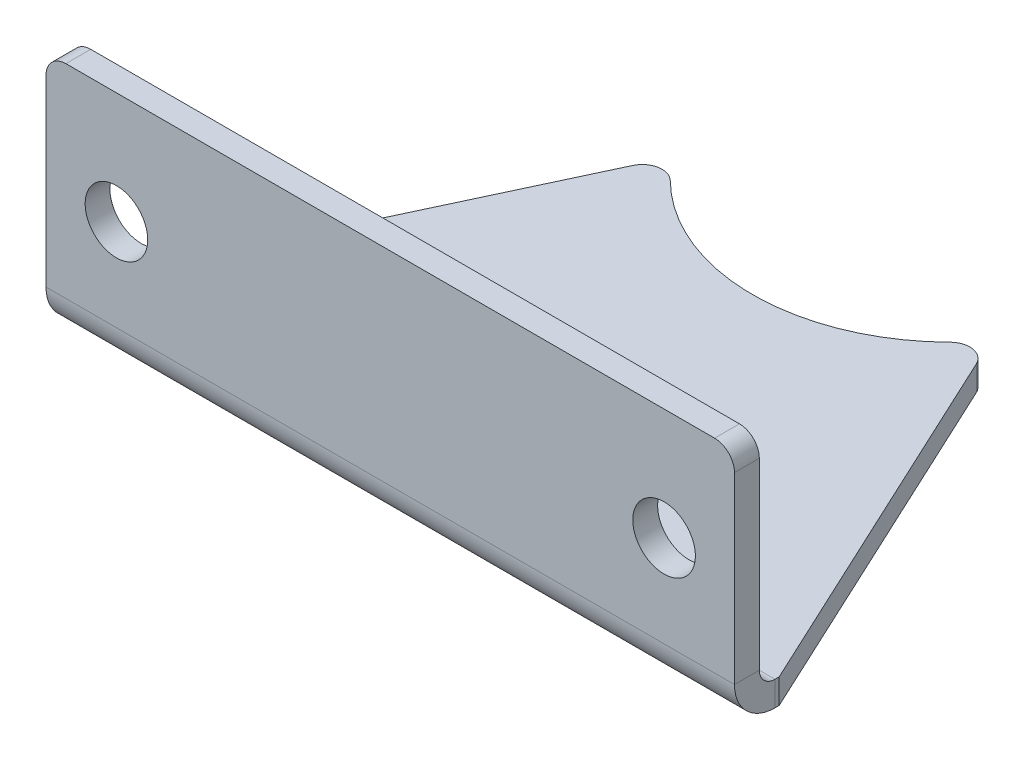
ISO-10303-21;
HEADER;
FILE_DESCRIPTION(('STEP AP214'),'2;1');
FILE_NAME('part.step','',(''),(''),'','','');
FILE_SCHEMA(('AUTOMOTIVE_DESIGN { 1 0 10303 214 1 1 1 1 }'));
ENDSEC;
DATA;
#1=APPLICATION_CONTEXT('core data for automotive mechanical design processes');
#2=APPLICATION_PROTOCOL_DEFINITION('international standard','automotive_design',2000,#1);
#3=PRODUCT_CONTEXT('',#1,'mechanical');
#4=PRODUCT('Part','Part','',(#3));
#5=PRODUCT_RELATED_PRODUCT_CATEGORY('part','',(#4));
#6=PRODUCT_DEFINITION_FORMATION('','',#4);
#7=PRODUCT_DEFINITION_CONTEXT('part definition',#1,'design');
#8=PRODUCT_DEFINITION('design','',#6,#7);
#9=PRODUCT_DEFINITION_SHAPE('','',#8);
#10=(LENGTH_UNIT() NAMED_UNIT(*) SI_UNIT(.MILLI.,.METRE.));
#11=(NAMED_UNIT(*) PLANE_ANGLE_UNIT() SI_UNIT($,.RADIAN.));
#12=(NAMED_UNIT(*) SI_UNIT($,.STERADIAN.) SOLID_ANGLE_UNIT());
#13=UNCERTAINTY_MEASURE_WITH_UNIT(LENGTH_MEASURE(1.E-05),#10,'distance_accuracy_value','');
#14=(GEOMETRIC_REPRESENTATION_CONTEXT(3) GLOBAL_UNCERTAINTY_ASSIGNED_CONTEXT((#13)) GLOBAL_UNIT_ASSIGNED_CONTEXT((#10,
#11,#12)) REPRESENTATION_CONTEXT('',''));
#15=CARTESIAN_POINT('',(0.,0.,0.));
#16=DIRECTION('',(0.,0.,1.));
#17=DIRECTION('',(1.,0.,0.));
#18=AXIS2_PLACEMENT_3D('',#15,#16,#17);
#19=CARTESIAN_POINT('',(-21.999999942,-1.5875,33.));
#20=DIRECTION('',(-0.906237866206464,0.,-0.422768175071818));
#21=DIRECTION('',(-0.422768175071818,0.,0.906237866206464));
#22=AXIS2_PLACEMENT_3D('',#19,#20,#21);
#23=PLANE('',#22);
#24=DIRECTION('',(-0.422768175071818,0.,0.906237866206464));
#25=VECTOR('',#24,1.);
#26=CARTESIAN_POINT('',(-21.999999942,0.,33.));
#27=LINE('',#26,#25);
#28=CARTESIAN_POINT('',(-10.9840169846898,0.,9.38634722752335));
#29=VERTEX_POINT('',#28);
#30=CARTESIAN_POINT('',(-21.999999942,0.,33.));
#31=VERTEX_POINT('',#30);
#32=EDGE_CURVE('E240',#29,#31,#27,.T.);
#33=ORIENTED_EDGE('',*,*,#32,.F.);
#34=DIRECTION('',(0.,1.,0.));
#35=VECTOR('',#34,1.);
#36=CARTESIAN_POINT('',(-10.9840169846898,-1.5875,9.38634722752335));
#37=LINE('',#36,#35);
#38=CARTESIAN_POINT('',(-10.9840169846898,-1.5875,9.38634722752335));
#39=VERTEX_POINT('',#38);
#40=EDGE_CURVE('E13',#29,#39,#37,.F.);
#41=ORIENTED_EDGE('',*,*,#40,.T.);
#42=DIRECTION('',(-0.422768175071818,0.,0.906237866206464));
#43=VECTOR('',#42,1.);
#44=CARTESIAN_POINT('',(-21.999999942,-1.5875,33.));
#45=LINE('',#44,#43);
#46=CARTESIAN_POINT('',(-21.999999942,-1.5875,33.));
#47=VERTEX_POINT('',#46);
#48=EDGE_CURVE('E243',#39,#47,#45,.T.);
#49=ORIENTED_EDGE('',*,*,#48,.T.);
#50=DIRECTION('',(0.,1.,0.));
#51=VECTOR('',#50,1.);
#52=CARTESIAN_POINT('',(-21.999999942,-1.5875,33.));
#53=LINE('',#52,#51);
#54=EDGE_CURVE('E251',#47,#31,#53,.T.);
#55=ORIENTED_EDGE('',*,*,#54,.T.);
#56=EDGE_LOOP('',(#33,#41,#49,#55));
#57=FACE_BOUND('',#56,.T.);
#58=ADVANCED_FACE('F62',(#57),#23,.T.);
#59=CARTESIAN_POINT('',(0.,-1.5875,0.));
#60=DIRECTION('',(0.,1.,0.));
#61=DIRECTION('',(0.,0.,1.));
#62=AXIS2_PLACEMENT_3D('',#59,#60,#61);
#63=CYLINDRICAL_SURFACE('',#62,12.7);
#64=CARTESIAN_POINT('',(0.,0.,0.));
#65=DIRECTION('',(0.,-1.,0.));
#66=DIRECTION('',(0.,0.,1.));
#67=AXIS2_PLACEMENT_3D('',#64,#65,#66);
#68=CIRCLE('',#67,12.7);
#69=CARTESIAN_POINT('',(8.93917717691604,0.,9.02114800896778));
#70=VERTEX_POINT('',#69);
#71=CARTESIAN_POINT('',(-8.93917717691603,0.,9.02114800896778));
#72=VERTEX_POINT('',#71);
#73=EDGE_CURVE('E246',#70,#72,#68,.T.);
#74=ORIENTED_EDGE('',*,*,#73,.F.);
#75=DIRECTION('',(0.,1.,0.));
#76=VECTOR('',#75,1.);
#77=CARTESIAN_POINT('',(8.93917717691604,-1.5875,9.02114800896778));
#78=LINE('',#77,#76);
#79=CARTESIAN_POINT('',(8.93917717691604,-1.5875,9.02114800896778));
#80=VERTEX_POINT('',#79);
#81=EDGE_CURVE('E290',#70,#80,#78,.F.);
#82=ORIENTED_EDGE('',*,*,#81,.T.);
#83=CARTESIAN_POINT('',(0.,-1.5875,0.));
#84=DIRECTION('',(0.,-1.,0.));
#85=DIRECTION('',(0.,0.,1.));
#86=AXIS2_PLACEMENT_3D('',#83,#84,#85);
#87=CIRCLE('',#86,12.7);
#88=CARTESIAN_POINT('',(-8.93917717691603,-1.5875,9.02114800896778));
#89=VERTEX_POINT('',#88);
#90=EDGE_CURVE('E249',#80,#89,#87,.T.);
#91=ORIENTED_EDGE('',*,*,#90,.T.);
#92=DIRECTION('',(0.,1.,0.));
#93=VECTOR('',#92,1.);
#94=CARTESIAN_POINT('',(-8.93917717691603,-1.5875,9.02114800896778));
#95=LINE('',#94,#93);
#96=EDGE_CURVE('E287',#89,#72,#95,.T.);
#97=ORIENTED_EDGE('',*,*,#96,.T.);
#98=EDGE_LOOP('',(#74,#82,#91,#97));
#99=FACE_BOUND('',#98,.T.);
#100=ADVANCED_FACE('F305',(#99),#63,.F.);
#101=CARTESIAN_POINT('',(21.999999942,-1.5875,33.));
#102=DIRECTION('',(0.906237866206464,0.,-0.422768175071818));
#103=DIRECTION('',(-0.422768175071818,0.,-0.906237866206464));
#104=AXIS2_PLACEMENT_3D('',#101,#102,#103);
#105=PLANE('',#104);
#106=DIRECTION('',(-0.422768175071818,0.,-0.906237866206464));
#107=VECTOR('',#106,1.);
#108=CARTESIAN_POINT('',(21.999999942,-1.5875,33.));
#109=LINE('',#108,#107);
#110=CARTESIAN_POINT('',(21.999999942,-1.5875,33.));
#111=VERTEX_POINT('',#110);
#112=CARTESIAN_POINT('',(10.9840169846899,-1.5875,9.38634722752336));
#113=VERTEX_POINT('',#112);
#114=EDGE_CURVE('E245',#111,#113,#109,.T.);
#115=ORIENTED_EDGE('',*,*,#114,.T.);
#116=DIRECTION('',(0.,1.,0.));
#117=VECTOR('',#116,1.);
#118=CARTESIAN_POINT('',(10.9840169846899,-1.5875,9.38634722752335));
#119=LINE('',#118,#117);
#120=CARTESIAN_POINT('',(10.9840169846899,0.,9.38634722752336));
#121=VERTEX_POINT('',#120);
#122=EDGE_CURVE('E280',#113,#121,#119,.T.);
#123=ORIENTED_EDGE('',*,*,#122,.T.);
#124=DIRECTION('',(-0.422768175071818,0.,-0.906237866206464));
#125=VECTOR('',#124,1.);
#126=CARTESIAN_POINT('',(21.999999942,0.,33.));
#127=LINE('',#126,#125);
#128=CARTESIAN_POINT('',(21.999999942,0.,33.));
#129=VERTEX_POINT('',#128);
#130=EDGE_CURVE('E253',#129,#121,#127,.T.);
#131=ORIENTED_EDGE('',*,*,#130,.F.);
#132=DIRECTION('',(0.,1.,0.));
#133=VECTOR('',#132,1.);
#134=CARTESIAN_POINT('',(21.999999942,-1.5875,33.));
#135=LINE('',#134,#133);
#136=EDGE_CURVE('E258',#111,#129,#135,.T.);
#137=ORIENTED_EDGE('',*,*,#136,.F.);
#138=EDGE_LOOP('',(#115,#123,#131,#137));
#139=FACE_BOUND('',#138,.T.);
#140=ADVANCED_FACE('F299',(#139),#105,.T.);
#141=CARTESIAN_POINT('',(0.,-1.5875,0.));
#142=DIRECTION('',(0.,1.,0.));
#143=DIRECTION('',(0.,0.,1.));
#144=AXIS2_PLACEMENT_3D('',#141,#142,#143);
#145=PLANE('',#144);
#146=ORIENTED_EDGE('',*,*,#90,.F.);
#147=CARTESIAN_POINT('',(9.83309489460765,-1.5875,9.92326280986456));
#148=DIRECTION('',(0.,1.,0.));
#149=DIRECTION('',(0.,0.,1.));
#150=AXIS2_PLACEMENT_3D('',#147,#148,#149);
#151=CIRCLE('',#150,1.27);
#152=EDGE_CURVE('E70',#80,#113,#151,.F.);
#153=ORIENTED_EDGE('',*,*,#152,.T.);
#154=ORIENTED_EDGE('',*,*,#114,.F.);
#155=DIRECTION('',(0.,0.,-1.));
#156=VECTOR('',#155,1.);
#157=CARTESIAN_POINT('',(21.999999942,-1.58750000000001,33.27));
#158=LINE('',#157,#156);
#159=CARTESIAN_POINT('',(21.999999942,-1.58750000000001,33.27));
#160=VERTEX_POINT('',#159);
#161=EDGE_CURVE('E234',#160,#111,#158,.T.);
#162=ORIENTED_EDGE('',*,*,#161,.F.);
#163=DIRECTION('',(1.,0.,0.));
#164=VECTOR('',#163,1.);
#165=CARTESIAN_POINT('',(21.999999942,-1.58750000000001,33.27));
#166=LINE('',#165,#164);
#167=CARTESIAN_POINT('',(-21.999999942,-1.58750000000001,33.27));
#168=VERTEX_POINT('',#167);
#169=EDGE_CURVE('E170',#160,#168,#166,.F.);
#170=ORIENTED_EDGE('',*,*,#169,.T.);
#171=DIRECTION('',(0.,0.,-1.));
#172=VECTOR('',#171,1.);
#173=CARTESIAN_POINT('',(-21.999999942,-1.58750000000001,33.27));
#174=LINE('',#173,#172);
#175=EDGE_CURVE('E231',#168,#47,#174,.T.);
#176=ORIENTED_EDGE('',*,*,#175,.T.);
#177=ORIENTED_EDGE('',*,*,#48,.F.);
#178=CARTESIAN_POINT('',(-9.83309489460764,-1.5875,9.92326280986456));
#179=DIRECTION('',(0.,1.,0.));
#180=DIRECTION('',(0.,0.,1.));
#181=AXIS2_PLACEMENT_3D('',#178,#179,#180);
#182=CIRCLE('',#181,1.27);
#183=EDGE_CURVE('E82',#39,#89,#182,.F.);
#184=ORIENTED_EDGE('',*,*,#183,.T.);
#185=EDGE_LOOP('',(#146,#153,#154,#162,#170,#176,#177,#184));
#186=FACE_BOUND('',#185,.T.);
#187=ADVANCED_FACE('F294',(#186),#145,.F.);
#188=CARTESIAN_POINT('',(0.,0.,0.));
#189=DIRECTION('',(0.,1.,0.));
#190=DIRECTION('',(0.,0.,1.));
#191=AXIS2_PLACEMENT_3D('',#188,#189,#190);
#192=PLANE('',#191);
#193=ORIENTED_EDGE('',*,*,#130,.T.);
#194=CARTESIAN_POINT('',(9.83309489460765,0.,9.92326280986456));
#195=DIRECTION('',(0.,1.,0.));
#196=DIRECTION('',(0.,0.,1.));
#197=AXIS2_PLACEMENT_3D('',#194,#195,#196);
#198=CIRCLE('',#197,1.27);
#199=EDGE_CURVE('E285',#121,#70,#198,.T.);
#200=ORIENTED_EDGE('',*,*,#199,.T.);
#201=ORIENTED_EDGE('',*,*,#73,.T.);
#202=CARTESIAN_POINT('',(-9.83309489460764,0.,9.92326280986456));
#203=DIRECTION('',(0.,1.,0.));
#204=DIRECTION('',(0.,0.,1.));
#205=AXIS2_PLACEMENT_3D('',#202,#203,#204);
#206=CIRCLE('',#205,1.27);
#207=EDGE_CURVE('E283',#72,#29,#206,.T.);
#208=ORIENTED_EDGE('',*,*,#207,.T.);
#209=ORIENTED_EDGE('',*,*,#32,.T.);
#210=DIRECTION('',(0.,0.,-1.));
#211=VECTOR('',#210,1.);
#212=CARTESIAN_POINT('',(-21.999999942,0.,33.27));
#213=LINE('',#212,#211);
#214=CARTESIAN_POINT('',(-21.999999942,0.,33.27));
#215=VERTEX_POINT('',#214);
#216=EDGE_CURVE('E228',#215,#31,#213,.T.);
#217=ORIENTED_EDGE('',*,*,#216,.F.);
#218=DIRECTION('',(1.,0.,0.));
#219=VECTOR('',#218,1.);
#220=CARTESIAN_POINT('',(21.999999942,0.,33.27));
#221=LINE('',#220,#219);
#222=CARTESIAN_POINT('',(21.999999942,0.,33.27));
#223=VERTEX_POINT('',#222);
#224=EDGE_CURVE('E222',#223,#215,#221,.F.);
#225=ORIENTED_EDGE('',*,*,#224,.F.);
#226=DIRECTION('',(0.,0.,-1.));
#227=VECTOR('',#226,1.);
#228=CARTESIAN_POINT('',(21.999999942,0.,33.27));
#229=LINE('',#228,#227);
#230=EDGE_CURVE('E237',#223,#129,#229,.T.);
#231=ORIENTED_EDGE('',*,*,#230,.T.);
#232=EDGE_LOOP('',(#193,#200,#201,#208,#209,#217,#225,#231));
#233=FACE_BOUND('',#232,.T.);
#234=ADVANCED_FACE('F303',(#233),#192,.T.);
#235=CARTESIAN_POINT('',(21.999999942,0.,33.27));
#236=DIRECTION('',(1.,0.,0.));
#237=DIRECTION('',(0.,-1.,0.));
#238=AXIS2_PLACEMENT_3D('',#235,#236,#237);
#239=PLANE('',#238);
#240=ORIENTED_EDGE('',*,*,#230,.F.);
#241=DIRECTION('',(0.,-1.,0.));
#242=VECTOR('',#241,1.);
#243=CARTESIAN_POINT('',(21.999999942,0.,33.27));
#244=LINE('',#243,#242);
#245=EDGE_CURVE('E218',#223,#160,#244,.T.);
#246=ORIENTED_EDGE('',*,*,#245,.T.);
#247=ORIENTED_EDGE('',*,*,#161,.T.);
#248=ORIENTED_EDGE('',*,*,#136,.T.);
#249=EDGE_LOOP('',(#240,#246,#247,#248));
#250=FACE_BOUND('',#249,.T.);
#251=ADVANCED_FACE('F359',(#250),#239,.T.);
#252=CARTESIAN_POINT('',(-21.999999942,0.,33.27));
#253=DIRECTION('',(1.,0.,0.));
#254=DIRECTION('',(0.,-1.,0.));
#255=AXIS2_PLACEMENT_3D('',#252,#253,#254);
#256=PLANE('',#255);
#257=ORIENTED_EDGE('',*,*,#175,.F.);
#258=DIRECTION('',(0.,-1.,0.));
#259=VECTOR('',#258,1.);
#260=CARTESIAN_POINT('',(-21.999999942,0.,33.27));
#261=LINE('',#260,#259);
#262=EDGE_CURVE('E225',#215,#168,#261,.T.);
#263=ORIENTED_EDGE('',*,*,#262,.F.);
#264=ORIENTED_EDGE('',*,*,#216,.T.);
#265=ORIENTED_EDGE('',*,*,#54,.F.);
#266=EDGE_LOOP('',(#257,#263,#264,#265));
#267=FACE_BOUND('',#266,.T.);
#268=ADVANCED_FACE('F313',(#267),#256,.F.);
#269=CARTESIAN_POINT('',(-21.999999942,0.999999999999994,33.27));
#270=DIRECTION('',(-1.,0.,0.));
#271=DIRECTION('',(0.,0.,1.));
#272=AXIS2_PLACEMENT_3D('',#269,#270,#271);
#273=PLANE('',#272);
#274=DIRECTION('',(0.,0.,-1.));
#275=VECTOR('',#274,1.);
#276=CARTESIAN_POINT('',(-21.999999942,0.999999999999994,35.8575));
#277=LINE('',#276,#275);
#278=CARTESIAN_POINT('',(-21.999999942,0.999999999999994,34.27));
#279=VERTEX_POINT('',#278);
#280=CARTESIAN_POINT('',(-21.999999942,0.999999999999994,35.8575));
#281=VERTEX_POINT('',#280);
#282=EDGE_CURVE('E212',#279,#281,#277,.F.);
#283=ORIENTED_EDGE('',*,*,#282,.F.);
#284=CARTESIAN_POINT('',(-21.999999942,0.999999999999994,33.27));
#285=DIRECTION('',(1.,0.,0.));
#286=DIRECTION('',(0.,0.,-1.));
#287=AXIS2_PLACEMENT_3D('',#284,#285,#286);
#288=CIRCLE('',#287,1.);
#289=EDGE_CURVE('E173',#215,#279,#288,.F.);
#290=ORIENTED_EDGE('',*,*,#289,.F.);
#291=ORIENTED_EDGE('',*,*,#262,.T.);
#292=CARTESIAN_POINT('',(-21.999999942,0.999999999999994,33.27));
#293=DIRECTION('',(1.,0.,0.));
#294=DIRECTION('',(0.,0.,-1.));
#295=AXIS2_PLACEMENT_3D('',#292,#293,#294);
#296=CIRCLE('',#295,2.5875);
#297=EDGE_CURVE('E217',#168,#281,#296,.F.);
#298=ORIENTED_EDGE('',*,*,#297,.T.);
#299=EDGE_LOOP('',(#283,#290,#291,#298));
#300=FACE_BOUND('',#299,.T.);
#301=ADVANCED_FACE('F322',(#300),#273,.T.);
#302=CARTESIAN_POINT('',(21.999999942,0.999999999999994,33.27));
#303=DIRECTION('',(-1.,0.,0.));
#304=DIRECTION('',(0.,0.,1.));
#305=AXIS2_PLACEMENT_3D('',#302,#303,#304);
#306=PLANE('',#305);
#307=CARTESIAN_POINT('',(21.999999942,0.999999999999994,33.27));
#308=DIRECTION('',(1.,0.,0.));
#309=DIRECTION('',(0.,0.,-1.));
#310=AXIS2_PLACEMENT_3D('',#307,#308,#309);
#311=CIRCLE('',#310,1.);
#312=CARTESIAN_POINT('',(21.999999942,0.999999999999994,34.27));
#313=VERTEX_POINT('',#312);
#314=EDGE_CURVE('E180',#313,#223,#311,.T.);
#315=ORIENTED_EDGE('',*,*,#314,.F.);
#316=DIRECTION('',(0.,0.,-1.));
#317=VECTOR('',#316,1.);
#318=CARTESIAN_POINT('',(21.999999942,0.999999999999994,34.27));
#319=LINE('',#318,#317);
#320=CARTESIAN_POINT('',(21.999999942,0.999999999999994,35.8575));
#321=VERTEX_POINT('',#320);
#322=EDGE_CURVE('E177',#313,#321,#319,.F.);
#323=ORIENTED_EDGE('',*,*,#322,.T.);
#324=CARTESIAN_POINT('',(21.999999942,0.999999999999994,33.27));
#325=DIRECTION('',(1.,0.,0.));
#326=DIRECTION('',(0.,0.,-1.));
#327=AXIS2_PLACEMENT_3D('',#324,#325,#326);
#328=CIRCLE('',#327,2.5875);
#329=EDGE_CURVE('E163',#321,#160,#328,.T.);
#330=ORIENTED_EDGE('',*,*,#329,.T.);
#331=ORIENTED_EDGE('',*,*,#245,.F.);
#332=EDGE_LOOP('',(#315,#323,#330,#331));
#333=FACE_BOUND('',#332,.T.);
#334=ADVANCED_FACE('F178',(#333),#306,.F.);
#335=CARTESIAN_POINT('',(21.999999942,0.999999999999994,33.27));
#336=DIRECTION('',(1.,0.,0.));
#337=DIRECTION('',(0.,0.,1.));
#338=AXIS2_PLACEMENT_3D('',#335,#336,#337);
#339=CYLINDRICAL_SURFACE('',#338,2.5875);
#340=ORIENTED_EDGE('',*,*,#169,.F.);
#341=ORIENTED_EDGE('',*,*,#329,.F.);
#342=DIRECTION('',(1.,0.,0.));
#343=VECTOR('',#342,1.);
#344=CARTESIAN_POINT('',(-21.999999942,0.999999999999994,35.8575));
#345=LINE('',#344,#343);
#346=EDGE_CURVE('E167',#321,#281,#345,.F.);
#347=ORIENTED_EDGE('',*,*,#346,.T.);
#348=ORIENTED_EDGE('',*,*,#297,.F.);
#349=EDGE_LOOP('',(#340,#341,#347,#348));
#350=FACE_BOUND('',#349,.T.);
#351=ADVANCED_FACE('F165',(#350),#339,.T.);
#352=CARTESIAN_POINT('',(21.999999942,0.999999999999994,33.27));
#353=DIRECTION('',(1.,0.,0.));
#354=DIRECTION('',(0.,0.,1.));
#355=AXIS2_PLACEMENT_3D('',#352,#353,#354);
#356=CYLINDRICAL_SURFACE('',#355,1.);
#357=ORIENTED_EDGE('',*,*,#224,.T.);
#358=ORIENTED_EDGE('',*,*,#289,.T.);
#359=DIRECTION('',(1.,0.,0.));
#360=VECTOR('',#359,1.);
#361=CARTESIAN_POINT('',(-21.999999942,0.999999999999994,34.27));
#362=LINE('',#361,#360);
#363=EDGE_CURVE('E185',#279,#313,#362,.T.);
#364=ORIENTED_EDGE('',*,*,#363,.T.);
#365=ORIENTED_EDGE('',*,*,#314,.T.);
#366=EDGE_LOOP('',(#357,#358,#364,#365));
#367=FACE_BOUND('',#366,.T.);
#368=ADVANCED_FACE('F318',(#367),#356,.F.);
#369=CARTESIAN_POINT('',(21.999999942,14.,35.8575));
#370=DIRECTION('',(-1.,0.,0.));
#371=DIRECTION('',(0.,0.,1.));
#372=AXIS2_PLACEMENT_3D('',#369,#370,#371);
#373=PLANE('',#372);
#374=DIRECTION('',(0.,-1.,0.));
#375=VECTOR('',#374,1.);
#376=CARTESIAN_POINT('',(21.999999942,14.,34.27));
#377=LINE('',#376,#375);
#378=CARTESIAN_POINT('',(21.999999942,12.73,34.27));
#379=VERTEX_POINT('',#378);
#380=EDGE_CURVE('E194',#313,#379,#377,.F.);
#381=ORIENTED_EDGE('',*,*,#380,.T.);
#382=DIRECTION('',(0.,0.,-1.));
#383=VECTOR('',#382,1.);
#384=CARTESIAN_POINT('',(21.999999942,12.73,35.8575));
#385=LINE('',#384,#383);
#386=CARTESIAN_POINT('',(21.999999942,12.73,35.8575));
#387=VERTEX_POINT('',#386);
#388=EDGE_CURVE('E198',#379,#387,#385,.F.);
#389=ORIENTED_EDGE('',*,*,#388,.T.);
#390=DIRECTION('',(0.,1.,0.));
#391=VECTOR('',#390,1.);
#392=CARTESIAN_POINT('',(21.999999942,0.,35.8575));
#393=LINE('',#392,#391);
#394=EDGE_CURVE('E190',#321,#387,#393,.T.);
#395=ORIENTED_EDGE('',*,*,#394,.F.);
#396=ORIENTED_EDGE('',*,*,#322,.F.);
#397=EDGE_LOOP('',(#381,#389,#395,#396));
#398=FACE_BOUND('',#397,.T.);
#399=ADVANCED_FACE('F196',(#398),#373,.F.);
#400=CARTESIAN_POINT('',(-21.999999942,0.,35.8575));
#401=DIRECTION('',(1.,0.,0.));
#402=DIRECTION('',(0.,0.,-1.));
#403=AXIS2_PLACEMENT_3D('',#400,#401,#402);
#404=PLANE('',#403);
#405=DIRECTION('',(0.,-1.,0.));
#406=VECTOR('',#405,1.);
#407=CARTESIAN_POINT('',(-21.999999942,0.,35.8575));
#408=LINE('',#407,#406);
#409=CARTESIAN_POINT('',(-21.999999942,12.73,35.8575));
#410=VERTEX_POINT('',#409);
#411=EDGE_CURVE('E193',#410,#281,#408,.T.);
#412=ORIENTED_EDGE('',*,*,#411,.F.);
#413=DIRECTION('',(0.,0.,-1.));
#414=VECTOR('',#413,1.);
#415=CARTESIAN_POINT('',(-21.999999942,12.73,35.8575));
#416=LINE('',#415,#414);
#417=CARTESIAN_POINT('',(-21.999999942,12.73,34.27));
#418=VERTEX_POINT('',#417);
#419=EDGE_CURVE('E277',#410,#418,#416,.T.);
#420=ORIENTED_EDGE('',*,*,#419,.T.);
#421=DIRECTION('',(0.,1.,0.));
#422=VECTOR('',#421,1.);
#423=CARTESIAN_POINT('',(-21.999999942,0.,34.27));
#424=LINE('',#423,#422);
#425=EDGE_CURVE('E200',#418,#279,#424,.F.);
#426=ORIENTED_EDGE('',*,*,#425,.T.);
#427=ORIENTED_EDGE('',*,*,#282,.T.);
#428=EDGE_LOOP('',(#412,#420,#426,#427));
#429=FACE_BOUND('',#428,.T.);
#430=ADVANCED_FACE('F324',(#429),#404,.F.);
#431=CARTESIAN_POINT('',(0.,0.,35.8575));
#432=DIRECTION('',(0.,0.,-1.));
#433=DIRECTION('',(-1.,0.,0.));
#434=AXIS2_PLACEMENT_3D('',#431,#432,#433);
#435=PLANE('',#434);
#436=CARTESIAN_POINT('',(17.5,6.865,35.8575));
#437=DIRECTION('',(0.,0.,-1.));
#438=DIRECTION('',(-1.,0.,0.));
#439=AXIS2_PLACEMENT_3D('',#436,#437,#438);
#440=CIRCLE('',#439,2.);
#441=CARTESIAN_POINT('',(15.5,6.865,35.8575));
#442=VERTEX_POINT('',#441);
#443=EDGE_CURVE('E215',#442,#442,#440,.T.);
#444=ORIENTED_EDGE('',*,*,#443,.T.);
#445=EDGE_LOOP('',(#444));
#446=FACE_BOUND('',#445,.T.);
#447=CARTESIAN_POINT('',(-17.5,6.865,35.8575));
#448=DIRECTION('',(0.,0.,-1.));
#449=DIRECTION('',(-1.,0.,0.));
#450=AXIS2_PLACEMENT_3D('',#447,#448,#449);
#451=CIRCLE('',#450,2.);
#452=CARTESIAN_POINT('',(-19.5,6.865,35.8575));
#453=VERTEX_POINT('',#452);
#454=EDGE_CURVE('E405',#453,#453,#451,.T.);
#455=ORIENTED_EDGE('',*,*,#454,.T.);
#456=EDGE_LOOP('',(#455));
#457=FACE_BOUND('',#456,.T.);
#458=ORIENTED_EDGE('',*,*,#394,.T.);
#459=CARTESIAN_POINT('',(20.729999942,12.73,35.8575));
#460=DIRECTION('',(0.,0.,-1.));
#461=DIRECTION('',(-1.,0.,0.));
#462=AXIS2_PLACEMENT_3D('',#459,#460,#461);
#463=CIRCLE('',#462,1.27);
#464=CARTESIAN_POINT('',(20.729999942,14.,35.8575));
#465=VERTEX_POINT('',#464);
#466=EDGE_CURVE('E275',#387,#465,#463,.F.);
#467=ORIENTED_EDGE('',*,*,#466,.T.);
#468=DIRECTION('',(-1.,0.,0.));
#469=VECTOR('',#468,1.);
#470=CARTESIAN_POINT('',(0.,14.,35.8575));
#471=LINE('',#470,#469);
#472=CARTESIAN_POINT('',(-20.729999942,14.,35.8575));
#473=VERTEX_POINT('',#472);
#474=EDGE_CURVE('E199',#465,#473,#471,.T.);
#475=ORIENTED_EDGE('',*,*,#474,.T.);
#476=CARTESIAN_POINT('',(-20.729999942,12.73,35.8575));
#477=DIRECTION('',(0.,0.,-1.));
#478=DIRECTION('',(-1.,0.,0.));
#479=AXIS2_PLACEMENT_3D('',#476,#477,#478);
#480=CIRCLE('',#479,1.27);
#481=EDGE_CURVE('E273',#473,#410,#480,.F.);
#482=ORIENTED_EDGE('',*,*,#481,.T.);
#483=ORIENTED_EDGE('',*,*,#411,.T.);
#484=ORIENTED_EDGE('',*,*,#346,.F.);
#485=EDGE_LOOP('',(#458,#467,#475,#482,#483,#484));
#486=FACE_BOUND('',#485,.T.);
#487=ADVANCED_FACE('F189',(#446,#457,#486),#435,.F.);
#488=CARTESIAN_POINT('',(0.,0.,34.27));
#489=DIRECTION('',(0.,0.,-1.));
#490=DIRECTION('',(-1.,0.,0.));
#491=AXIS2_PLACEMENT_3D('',#488,#489,#490);
#492=PLANE('',#491);
#493=CARTESIAN_POINT('',(17.5,6.865,34.27));
#494=DIRECTION('',(0.,0.,-1.));
#495=DIRECTION('',(-1.,0.,0.));
#496=AXIS2_PLACEMENT_3D('',#493,#494,#495);
#497=CIRCLE('',#496,2.);
#498=CARTESIAN_POINT('',(15.5,6.865,34.27));
#499=VERTEX_POINT('',#498);
#500=EDGE_CURVE('E400',#499,#499,#497,.T.);
#501=ORIENTED_EDGE('',*,*,#500,.F.);
#502=EDGE_LOOP('',(#501));
#503=FACE_BOUND('',#502,.T.);
#504=CARTESIAN_POINT('',(-17.5,6.865,34.27));
#505=DIRECTION('',(0.,0.,-1.));
#506=DIRECTION('',(-1.,0.,0.));
#507=AXIS2_PLACEMENT_3D('',#504,#505,#506);
#508=CIRCLE('',#507,2.);
#509=CARTESIAN_POINT('',(-19.5,6.865,34.27));
#510=VERTEX_POINT('',#509);
#511=EDGE_CURVE('E401',#510,#510,#508,.T.);
#512=ORIENTED_EDGE('',*,*,#511,.F.);
#513=EDGE_LOOP('',(#512));
#514=FACE_BOUND('',#513,.T.);
#515=DIRECTION('',(1.,0.,0.));
#516=VECTOR('',#515,1.);
#517=CARTESIAN_POINT('',(-21.999999942,14.,34.27));
#518=LINE('',#517,#516);
#519=CARTESIAN_POINT('',(20.729999942,14.,34.27));
#520=VERTEX_POINT('',#519);
#521=CARTESIAN_POINT('',(-20.729999942,14.,34.27));
#522=VERTEX_POINT('',#521);
#523=EDGE_CURVE('E204',#520,#522,#518,.F.);
#524=ORIENTED_EDGE('',*,*,#523,.F.);
#525=CARTESIAN_POINT('',(20.729999942,12.73,34.27));
#526=DIRECTION('',(0.,0.,-1.));
#527=DIRECTION('',(-1.,0.,0.));
#528=AXIS2_PLACEMENT_3D('',#525,#526,#527);
#529=CIRCLE('',#528,1.27);
#530=EDGE_CURVE('E270',#520,#379,#529,.T.);
#531=ORIENTED_EDGE('',*,*,#530,.T.);
#532=ORIENTED_EDGE('',*,*,#380,.F.);
#533=ORIENTED_EDGE('',*,*,#363,.F.);
#534=ORIENTED_EDGE('',*,*,#425,.F.);
#535=CARTESIAN_POINT('',(-20.729999942,12.73,34.27));
#536=DIRECTION('',(0.,0.,-1.));
#537=DIRECTION('',(-1.,0.,0.));
#538=AXIS2_PLACEMENT_3D('',#535,#536,#537);
#539=CIRCLE('',#538,1.27);
#540=EDGE_CURVE('E268',#418,#522,#539,.T.);
#541=ORIENTED_EDGE('',*,*,#540,.T.);
#542=EDGE_LOOP('',(#524,#531,#532,#533,#534,#541));
#543=FACE_BOUND('',#542,.T.);
#544=ADVANCED_FACE('F329',(#503,#514,#543),#492,.T.);
#545=CARTESIAN_POINT('',(-21.999999942,14.,35.8575));
#546=DIRECTION('',(0.,-1.,0.));
#547=DIRECTION('',(0.,0.,-1.));
#548=AXIS2_PLACEMENT_3D('',#545,#546,#547);
#549=PLANE('',#548);
#550=ORIENTED_EDGE('',*,*,#474,.F.);
#551=DIRECTION('',(0.,0.,-1.));
#552=VECTOR('',#551,1.);
#553=CARTESIAN_POINT('',(20.729999942,14.,35.8575));
#554=LINE('',#553,#552);
#555=EDGE_CURVE('E265',#465,#520,#554,.T.);
#556=ORIENTED_EDGE('',*,*,#555,.T.);
#557=ORIENTED_EDGE('',*,*,#523,.T.);
#558=DIRECTION('',(0.,0.,-1.));
#559=VECTOR('',#558,1.);
#560=CARTESIAN_POINT('',(-20.729999942,14.,35.8575));
#561=LINE('',#560,#559);
#562=EDGE_CURVE('E261',#522,#473,#561,.F.);
#563=ORIENTED_EDGE('',*,*,#562,.T.);
#564=EDGE_LOOP('',(#550,#556,#557,#563));
#565=FACE_BOUND('',#564,.T.);
#566=ADVANCED_FACE('F336',(#565),#549,.F.);
#567=CARTESIAN_POINT('',(20.729999942,12.73,35.8575));
#568=DIRECTION('',(0.,0.,-1.));
#569=DIRECTION('',(-1.,0.,0.));
#570=AXIS2_PLACEMENT_3D('',#567,#568,#569);
#571=CYLINDRICAL_SURFACE('',#570,1.27);
#572=ORIENTED_EDGE('',*,*,#466,.F.);
#573=ORIENTED_EDGE('',*,*,#388,.F.);
#574=ORIENTED_EDGE('',*,*,#530,.F.);
#575=ORIENTED_EDGE('',*,*,#555,.F.);
#576=EDGE_LOOP('',(#572,#573,#574,#575));
#577=FACE_BOUND('',#576,.T.);
#578=ADVANCED_FACE('F331',(#577),#571,.T.);
#579=CARTESIAN_POINT('',(-20.729999942,12.73,35.8575));
#580=DIRECTION('',(0.,0.,-1.));
#581=DIRECTION('',(-1.,0.,0.));
#582=AXIS2_PLACEMENT_3D('',#579,#580,#581);
#583=CYLINDRICAL_SURFACE('',#582,1.27);
#584=ORIENTED_EDGE('',*,*,#481,.F.);
#585=ORIENTED_EDGE('',*,*,#562,.F.);
#586=ORIENTED_EDGE('',*,*,#540,.F.);
#587=ORIENTED_EDGE('',*,*,#419,.F.);
#588=EDGE_LOOP('',(#584,#585,#586,#587));
#589=FACE_BOUND('',#588,.T.);
#590=ADVANCED_FACE('F339',(#589),#583,.T.);
#591=CARTESIAN_POINT('',(9.83309489460765,-1.5875,9.92326280986456));
#592=DIRECTION('',(0.,1.,0.));
#593=DIRECTION('',(0.,0.,1.));
#594=AXIS2_PLACEMENT_3D('',#591,#592,#593);
#595=CYLINDRICAL_SURFACE('',#594,1.27);
#596=ORIENTED_EDGE('',*,*,#152,.F.);
#597=ORIENTED_EDGE('',*,*,#81,.F.);
#598=ORIENTED_EDGE('',*,*,#199,.F.);
#599=ORIENTED_EDGE('',*,*,#122,.F.);
#600=EDGE_LOOP('',(#596,#597,#598,#599));
#601=FACE_BOUND('',#600,.T.);
#602=ADVANCED_FACE('F300',(#601),#595,.T.);
#603=CARTESIAN_POINT('',(-9.83309489460764,-1.5875,9.92326280986456));
#604=DIRECTION('',(0.,1.,0.));
#605=DIRECTION('',(0.,0.,1.));
#606=AXIS2_PLACEMENT_3D('',#603,#604,#605);
#607=CYLINDRICAL_SURFACE('',#606,1.27);
#608=ORIENTED_EDGE('',*,*,#183,.F.);
#609=ORIENTED_EDGE('',*,*,#40,.F.);
#610=ORIENTED_EDGE('',*,*,#207,.F.);
#611=ORIENTED_EDGE('',*,*,#96,.F.);
#612=EDGE_LOOP('',(#608,#609,#610,#611));
#613=FACE_BOUND('',#612,.T.);
#614=ADVANCED_FACE('F64',(#613),#607,.T.);
#615=CARTESIAN_POINT('',(-17.5,6.865,35.8575));
#616=DIRECTION('',(0.,0.,-1.));
#617=DIRECTION('',(-1.,0.,0.));
#618=AXIS2_PLACEMENT_3D('',#615,#616,#617);
#619=CYLINDRICAL_SURFACE('',#618,2.);
#620=CARTESIAN_POINT('',(-19.5,6.865,35.8575));
#621=CARTESIAN_POINT('',(-19.5,6.865,35.8409635416667));
#622=CARTESIAN_POINT('',(-19.5,6.865,35.8244270833333));
#623=CARTESIAN_POINT('',(-19.5,6.865,35.7913541666667));
#624=CARTESIAN_POINT('',(-19.5,6.865,35.7748177083333));
#625=CARTESIAN_POINT('',(-19.5,6.865,35.7417447916667));
#626=CARTESIAN_POINT('',(-19.5,6.865,35.7252083333333));
#627=CARTESIAN_POINT('',(-19.5,6.865,35.6921354166667));
#628=CARTESIAN_POINT('',(-19.5,6.865,35.6755989583333));
#629=CARTESIAN_POINT('',(-19.5,6.865,35.6425260416667));
#630=CARTESIAN_POINT('',(-19.5,6.865,35.6259895833333));
#631=CARTESIAN_POINT('',(-19.5,6.865,35.5929166666667));
#632=CARTESIAN_POINT('',(-19.5,6.865,35.5763802083333));
#633=CARTESIAN_POINT('',(-19.5,6.865,35.5433072916667));
#634=CARTESIAN_POINT('',(-19.5,6.865,35.5267708333333));
#635=CARTESIAN_POINT('',(-19.5,6.865,35.4936979166667));
#636=CARTESIAN_POINT('',(-19.5,6.865,35.4771614583333));
#637=CARTESIAN_POINT('',(-19.5,6.865,35.4440885416667));
#638=CARTESIAN_POINT('',(-19.5,6.865,35.4275520833333));
#639=CARTESIAN_POINT('',(-19.5,6.865,35.3944791666667));
#640=CARTESIAN_POINT('',(-19.5,6.865,35.3779427083333));
#641=CARTESIAN_POINT('',(-19.5,6.865,35.3448697916667));
#642=CARTESIAN_POINT('',(-19.5,6.865,35.3283333333333));
#643=CARTESIAN_POINT('',(-19.5,6.865,35.2952604166667));
#644=CARTESIAN_POINT('',(-19.5,6.865,35.2787239583333));
#645=CARTESIAN_POINT('',(-19.5,6.865,35.2456510416667));
#646=CARTESIAN_POINT('',(-19.5,6.865,35.2291145833333));
#647=CARTESIAN_POINT('',(-19.5,6.865,35.1960416666667));
#648=CARTESIAN_POINT('',(-19.5,6.865,35.1795052083333));
#649=CARTESIAN_POINT('',(-19.5,6.865,35.1464322916667));
#650=CARTESIAN_POINT('',(-19.5,6.865,35.1298958333333));
#651=CARTESIAN_POINT('',(-19.5,6.865,35.0968229166667));
#652=CARTESIAN_POINT('',(-19.5,6.865,35.0802864583333));
#653=CARTESIAN_POINT('',(-19.5,6.865,35.0472135416667));
#654=CARTESIAN_POINT('',(-19.5,6.865,35.0306770833333));
#655=CARTESIAN_POINT('',(-19.5,6.865,34.9976041666667));
#656=CARTESIAN_POINT('',(-19.5,6.865,34.9810677083333));
#657=CARTESIAN_POINT('',(-19.5,6.865,34.9479947916667));
#658=CARTESIAN_POINT('',(-19.5,6.865,34.9314583333333));
#659=CARTESIAN_POINT('',(-19.5,6.865,34.8983854166667));
#660=CARTESIAN_POINT('',(-19.5,6.865,34.8818489583333));
#661=CARTESIAN_POINT('',(-19.5,6.865,34.8487760416667));
#662=CARTESIAN_POINT('',(-19.5,6.865,34.8322395833333));
#663=CARTESIAN_POINT('',(-19.5,6.865,34.7991666666667));
#664=CARTESIAN_POINT('',(-19.5,6.865,34.7826302083333));
#665=CARTESIAN_POINT('',(-19.5,6.865,34.7495572916667));
#666=CARTESIAN_POINT('',(-19.5,6.865,34.7330208333333));
#667=CARTESIAN_POINT('',(-19.5,6.865,34.6999479166667));
#668=CARTESIAN_POINT('',(-19.5,6.865,34.6834114583333));
#669=CARTESIAN_POINT('',(-19.5,6.865,34.6503385416667));
#670=CARTESIAN_POINT('',(-19.5,6.865,34.6338020833333));
#671=CARTESIAN_POINT('',(-19.5,6.865,34.6007291666667));
#672=CARTESIAN_POINT('',(-19.5,6.865,34.5841927083333));
#673=CARTESIAN_POINT('',(-19.5,6.865,34.5511197916667));
#674=CARTESIAN_POINT('',(-19.5,6.865,34.5345833333333));
#675=CARTESIAN_POINT('',(-19.5,6.865,34.5015104166667));
#676=CARTESIAN_POINT('',(-19.5,6.865,34.4849739583333));
#677=CARTESIAN_POINT('',(-19.5,6.865,34.4519010416667));
#678=CARTESIAN_POINT('',(-19.5,6.865,34.4353645833333));
#679=CARTESIAN_POINT('',(-19.5,6.865,34.4022916666667));
#680=CARTESIAN_POINT('',(-19.5,6.865,34.3857552083333));
#681=CARTESIAN_POINT('',(-19.5,6.865,34.3526822916667));
#682=CARTESIAN_POINT('',(-19.5,6.865,34.3361458333333));
#683=CARTESIAN_POINT('',(-19.5,6.865,34.3030729166667));
#684=CARTESIAN_POINT('',(-19.5,6.865,34.2865364583333));
#685=CARTESIAN_POINT('',(-19.5,6.865,34.27));
#686=B_SPLINE_CURVE_WITH_KNOTS('',3,(#620,#621,#622,#623,#624,#625,#626,#627,#628,#629,#630,
#631,#632,#633,#634,#635,#636,#637,#638,#639,#640,#641,#642,#643,#644,#645,#646,#647,#648,#649,
#650,#651,#652,#653,#654,#655,#656,#657,#658,#659,#660,#661,#662,#663,#664,#665,#666,#667,#668,
#669,#670,#671,#672,#673,#674,#675,#676,#677,#678,#679,#680,#681,#682,#683,#684,#685),
.UNSPECIFIED.,.F.,.F.,(4,2,2,2,2,2,2,2,2,2,2,2,2,2,2,2,2,2,2,2,2,2,2,2,2,2,2,2,2,2,2,2,4),(0.,
0.0496093750000023,0.0992187500000047,0.148828125000007,0.198437500000002,0.248046875000005,
0.297656250000007,0.347265625000003,0.396875000000005,0.446484375000007,0.496093750000003,
0.545703125000005,0.595312500000007,0.644921875000003,0.694531250000005,0.744140625000007,
0.79375000000001,0.843359375000005,0.892968750000007,0.94257812500001,0.992187500000005,
1.04179687500001,1.09140625000001,1.14101562500001,1.19062500000001,1.24023437500001,
1.28984375000001,1.33945312500001,1.38906250000001,1.43867187500001,1.48828125000001,
1.53789062500001,1.58750000000001),.UNSPECIFIED.);
#687=EDGE_CURVE('BSEAM386',#453,#510,#686,.T.);
#688=ORIENTED_EDGE('',*,*,#454,.F.);
#689=ORIENTED_EDGE('',*,*,#511,.T.);
#690=ORIENTED_EDGE('',*,*,#687,.T.);
#691=ORIENTED_EDGE('',*,*,#687,.F.);
#692=EDGE_LOOP('',(#688,#690,#689,#691));
#693=FACE_BOUND('',#692,.T.);
#694=ADVANCED_FACE('F386',(#693),#619,.F.);
#695=CARTESIAN_POINT('',(17.5,6.865,35.8575));
#696=DIRECTION('',(0.,0.,-1.));
#697=DIRECTION('',(-1.,0.,0.));
#698=AXIS2_PLACEMENT_3D('',#695,#696,#697);
#699=CYLINDRICAL_SURFACE('',#698,2.);
#700=CARTESIAN_POINT('',(15.5,6.865,35.8575));
#701=CARTESIAN_POINT('',(15.5,6.865,35.8409635416667));
#702=CARTESIAN_POINT('',(15.5,6.865,35.8244270833333));
#703=CARTESIAN_POINT('',(15.5,6.865,35.7913541666667));
#704=CARTESIAN_POINT('',(15.5,6.865,35.7748177083333));
#705=CARTESIAN_POINT('',(15.5,6.865,35.7417447916667));
#706=CARTESIAN_POINT('',(15.5,6.865,35.7252083333333));
#707=CARTESIAN_POINT('',(15.5,6.865,35.6921354166667));
#708=CARTESIAN_POINT('',(15.5,6.865,35.6755989583333));
#709=CARTESIAN_POINT('',(15.5,6.865,35.6425260416667));
#710=CARTESIAN_POINT('',(15.5,6.865,35.6259895833333));
#711=CARTESIAN_POINT('',(15.5,6.865,35.5929166666667));
#712=CARTESIAN_POINT('',(15.5,6.865,35.5763802083333));
#713=CARTESIAN_POINT('',(15.5,6.865,35.5433072916667));
#714=CARTESIAN_POINT('',(15.5,6.865,35.5267708333333));
#715=CARTESIAN_POINT('',(15.5,6.865,35.4936979166667));
#716=CARTESIAN_POINT('',(15.5,6.865,35.4771614583333));
#717=CARTESIAN_POINT('',(15.5,6.865,35.4440885416667));
#718=CARTESIAN_POINT('',(15.5,6.865,35.4275520833333));
#719=CARTESIAN_POINT('',(15.5,6.865,35.3944791666667));
#720=CARTESIAN_POINT('',(15.5,6.865,35.3779427083333));
#721=CARTESIAN_POINT('',(15.5,6.865,35.3448697916667));
#722=CARTESIAN_POINT('',(15.5,6.865,35.3283333333333));
#723=CARTESIAN_POINT('',(15.5,6.865,35.2952604166667));
#724=CARTESIAN_POINT('',(15.5,6.865,35.2787239583333));
#725=CARTESIAN_POINT('',(15.5,6.865,35.2456510416667));
#726=CARTESIAN_POINT('',(15.5,6.865,35.2291145833333));
#727=CARTESIAN_POINT('',(15.5,6.865,35.1960416666667));
#728=CARTESIAN_POINT('',(15.5,6.865,35.1795052083333));
#729=CARTESIAN_POINT('',(15.5,6.865,35.1464322916667));
#730=CARTESIAN_POINT('',(15.5,6.865,35.1298958333333));
#731=CARTESIAN_POINT('',(15.5,6.865,35.0968229166667));
#732=CARTESIAN_POINT('',(15.5,6.865,35.0802864583333));
#733=CARTESIAN_POINT('',(15.5,6.865,35.0472135416667));
#734=CARTESIAN_POINT('',(15.5,6.865,35.0306770833333));
#735=CARTESIAN_POINT('',(15.5,6.865,34.9976041666667));
#736=CARTESIAN_POINT('',(15.5,6.865,34.9810677083333));
#737=CARTESIAN_POINT('',(15.5,6.865,34.9479947916667));
#738=CARTESIAN_POINT('',(15.5,6.865,34.9314583333333));
#739=CARTESIAN_POINT('',(15.5,6.865,34.8983854166667));
#740=CARTESIAN_POINT('',(15.5,6.865,34.8818489583333));
#741=CARTESIAN_POINT('',(15.5,6.865,34.8487760416667));
#742=CARTESIAN_POINT('',(15.5,6.865,34.8322395833333));
#743=CARTESIAN_POINT('',(15.5,6.865,34.7991666666667));
#744=CARTESIAN_POINT('',(15.5,6.865,34.7826302083333));
#745=CARTESIAN_POINT('',(15.5,6.865,34.7495572916667));
#746=CARTESIAN_POINT('',(15.5,6.865,34.7330208333333));
#747=CARTESIAN_POINT('',(15.5,6.865,34.6999479166667));
#748=CARTESIAN_POINT('',(15.5,6.865,34.6834114583333));
#749=CARTESIAN_POINT('',(15.5,6.865,34.6503385416667));
#750=CARTESIAN_POINT('',(15.5,6.865,34.6338020833333));
#751=CARTESIAN_POINT('',(15.5,6.865,34.6007291666667));
#752=CARTESIAN_POINT('',(15.5,6.865,34.5841927083333));
#753=CARTESIAN_POINT('',(15.5,6.865,34.5511197916667));
#754=CARTESIAN_POINT('',(15.5,6.865,34.5345833333333));
#755=CARTESIAN_POINT('',(15.5,6.865,34.5015104166667));
#756=CARTESIAN_POINT('',(15.5,6.865,34.4849739583333));
#757=CARTESIAN_POINT('',(15.5,6.865,34.4519010416667));
#758=CARTESIAN_POINT('',(15.5,6.865,34.4353645833333));
#759=CARTESIAN_POINT('',(15.5,6.865,34.4022916666667));
#760=CARTESIAN_POINT('',(15.5,6.865,34.3857552083333));
#761=CARTESIAN_POINT('',(15.5,6.865,34.3526822916667));
#762=CARTESIAN_POINT('',(15.5,6.865,34.3361458333333));
#763=CARTESIAN_POINT('',(15.5,6.865,34.3030729166667));
#764=CARTESIAN_POINT('',(15.5,6.865,34.2865364583333));
#765=CARTESIAN_POINT('',(15.5,6.865,34.27));
#766=B_SPLINE_CURVE_WITH_KNOTS('',3,(#700,#701,#702,#703,#704,#705,#706,#707,#708,#709,#710,
#711,#712,#713,#714,#715,#716,#717,#718,#719,#720,#721,#722,#723,#724,#725,#726,#727,#728,#729,
#730,#731,#732,#733,#734,#735,#736,#737,#738,#739,#740,#741,#742,#743,#744,#745,#746,#747,#748,
#749,#750,#751,#752,#753,#754,#755,#756,#757,#758,#759,#760,#761,#762,#763,#764,#765),
.UNSPECIFIED.,.F.,.F.,(4,2,2,2,2,2,2,2,2,2,2,2,2,2,2,2,2,2,2,2,2,2,2,2,2,2,2,2,2,2,2,2,4),(0.,
0.0496093750000023,0.0992187500000047,0.148828125000007,0.198437500000002,0.248046875000005,
0.297656250000007,0.347265625000003,0.396875000000005,0.446484375000007,0.496093750000003,
0.545703125000005,0.595312500000007,0.644921875000003,0.694531250000005,0.744140625000007,
0.79375000000001,0.843359375000005,0.892968750000007,0.94257812500001,0.992187500000005,
1.04179687500001,1.09140625000001,1.14101562500001,1.19062500000001,1.24023437500001,
1.28984375000001,1.33945312500001,1.38906250000001,1.43867187500001,1.48828125000001,
1.53789062500001,1.58750000000001),.UNSPECIFIED.);
#767=EDGE_CURVE('BSEAM389',#442,#499,#766,.T.);
#768=ORIENTED_EDGE('',*,*,#443,.F.);
#769=ORIENTED_EDGE('',*,*,#500,.T.);
#770=ORIENTED_EDGE('',*,*,#767,.T.);
#771=ORIENTED_EDGE('',*,*,#767,.F.);
#772=EDGE_LOOP('',(#768,#770,#769,#771));
#773=FACE_BOUND('',#772,.T.);
#774=ADVANCED_FACE('F389',(#773),#699,.F.);
#775=CLOSED_SHELL('',(#58,#100,#140,#187,#234,#251,#268,#301,#334,#351,#368,#399,#430,#487,#544,
#566,#578,#590,#602,#614,#694,#774));
#776=MANIFOLD_SOLID_BREP('B2',#775);
#777=ADVANCED_BREP_SHAPE_REPRESENTATION('',(#18,#776),#14);
#778=SHAPE_DEFINITION_REPRESENTATION(#9,#777);
ENDSEC;
END-ISO-10303-21;
